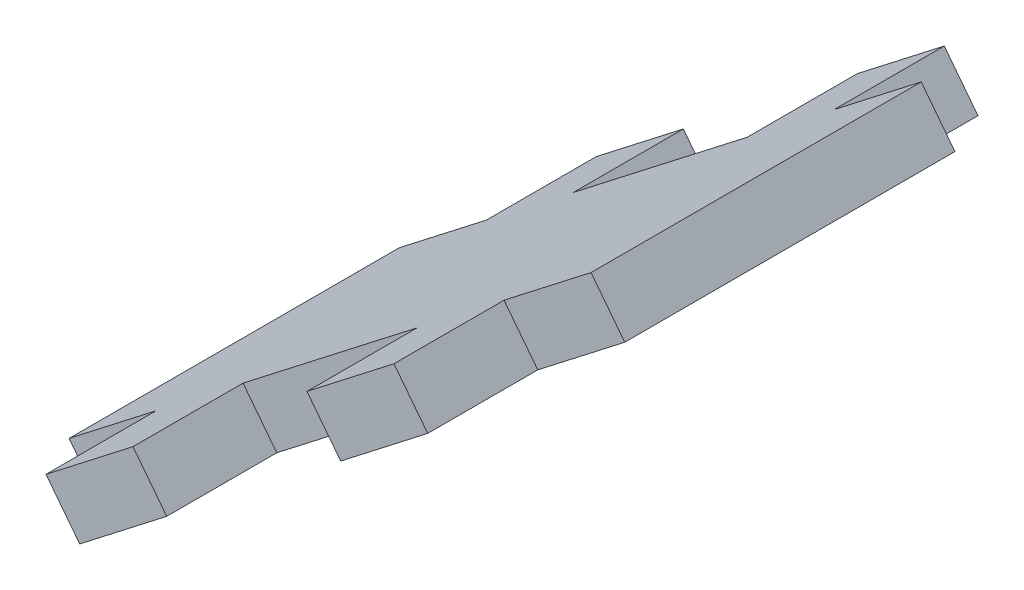
ISO-10303-21;
HEADER;
FILE_DESCRIPTION(('STEP AP214'),'2;1');
FILE_NAME('part.step','',(''),(''),'','','');
FILE_SCHEMA(('AUTOMOTIVE_DESIGN { 1 0 10303 214 1 1 1 1 }'));
ENDSEC;
DATA;
#1=APPLICATION_CONTEXT('core data for automotive mechanical design processes');
#2=APPLICATION_PROTOCOL_DEFINITION('international standard','automotive_design',2000,#1);
#3=PRODUCT_CONTEXT('',#1,'mechanical');
#4=PRODUCT('Part','Part','',(#3));
#5=PRODUCT_RELATED_PRODUCT_CATEGORY('part','',(#4));
#6=PRODUCT_DEFINITION_FORMATION('','',#4);
#7=PRODUCT_DEFINITION_CONTEXT('part definition',#1,'design');
#8=PRODUCT_DEFINITION('design','',#6,#7);
#9=PRODUCT_DEFINITION_SHAPE('','',#8);
#10=(LENGTH_UNIT() NAMED_UNIT(*) SI_UNIT(.MILLI.,.METRE.));
#11=(NAMED_UNIT(*) PLANE_ANGLE_UNIT() SI_UNIT($,.RADIAN.));
#12=(NAMED_UNIT(*) SI_UNIT($,.STERADIAN.) SOLID_ANGLE_UNIT());
#13=UNCERTAINTY_MEASURE_WITH_UNIT(LENGTH_MEASURE(1.E-05),#10,'distance_accuracy_value','');
#14=(GEOMETRIC_REPRESENTATION_CONTEXT(3) GLOBAL_UNCERTAINTY_ASSIGNED_CONTEXT((#13)) GLOBAL_UNIT_ASSIGNED_CONTEXT((#10,
#11,#12)) REPRESENTATION_CONTEXT('',''));
#15=CARTESIAN_POINT('',(0.,0.,0.));
#16=DIRECTION('',(0.,0.,1.));
#17=DIRECTION('',(1.,0.,0.));
#18=AXIS2_PLACEMENT_3D('',#15,#16,#17);
#19=CARTESIAN_POINT('',(0.,0.,0.));
#20=DIRECTION('',(0.,0.,-1.));
#21=DIRECTION('',(-1.,0.,0.));
#22=AXIS2_PLACEMENT_3D('',#19,#20,#21);
#23=PLANE('',#22);
#24=DIRECTION('',(-0.790358439275779,-0.612644707367618,0.));
#25=VECTOR('',#24,1.);
#26=CARTESIAN_POINT('',(-104.229947398695,305.349449517999,0.));
#27=LINE('',#26,#25);
#28=CARTESIAN_POINT('',(-124.305051756299,289.788273950861,0.));
#29=VERTEX_POINT('',#28);
#30=CARTESIAN_POINT('',(-129.323827845701,285.897980059077,0.));
#31=VERTEX_POINT('',#30);
#32=EDGE_CURVE('E247',#29,#31,#27,.T.);
#33=ORIENTED_EDGE('',*,*,#32,.F.);
#34=DIRECTION('',(-0.612644707367617,0.79035843927578,0.));
#35=VECTOR('',#34,1.);
#36=CARTESIAN_POINT('',(62.668868679989,48.5776437696957,0.));
#37=LINE('',#36,#35);
#38=CARTESIAN_POINT('',(-126.250198702192,292.297661995562,0.));
#39=VERTEX_POINT('',#38);
#40=EDGE_CURVE('E230',#29,#39,#37,.T.);
#41=ORIENTED_EDGE('',*,*,#40,.T.);
#42=DIRECTION('',(0.79035843927578,0.612644707367617,0.));
#43=VECTOR('',#42,1.);
#44=CARTESIAN_POINT('',(-136.287750880994,284.517074211993,0.));
#45=LINE('',#44,#43);
#46=CARTESIAN_POINT('',(-131.268974791593,288.407368103778,0.));
#47=VERTEX_POINT('',#46);
#48=EDGE_CURVE('E243',#47,#39,#45,.T.);
#49=ORIENTED_EDGE('',*,*,#48,.F.);
#50=DIRECTION('',(0.612644707367617,-0.79035843927578,0.));
#51=VECTOR('',#50,1.);
#52=CARTESIAN_POINT('',(57.6500925905878,44.6873498779113,0.));
#53=LINE('',#52,#51);
#54=EDGE_CURVE('E221',#47,#31,#53,.T.);
#55=ORIENTED_EDGE('',*,*,#54,.T.);
#56=EDGE_LOOP('',(#33,#41,#49,#55));
#57=FACE_BOUND('',#56,.T.);
#58=ADVANCED_FACE('F33',(#57),#23,.F.);
#59=CARTESIAN_POINT('',(0.,0.,-31.75));
#60=DIRECTION('',(0.,0.,-1.));
#61=DIRECTION('',(-1.,0.,0.));
#62=AXIS2_PLACEMENT_3D('',#59,#60,#61);
#63=PLANE('',#62);
#64=DIRECTION('',(-0.612644707367617,0.79035843927578,0.));
#65=VECTOR('',#64,1.);
#66=CARTESIAN_POINT('',(62.668868679989,48.5776437696957,-31.75));
#67=LINE('',#66,#65);
#68=CARTESIAN_POINT('',(-124.305051756299,289.788273950861,-31.75));
#69=VERTEX_POINT('',#68);
#70=CARTESIAN_POINT('',(-126.250198702192,292.297661995562,-31.75));
#71=VERTEX_POINT('',#70);
#72=EDGE_CURVE('E216',#69,#71,#67,.T.);
#73=ORIENTED_EDGE('',*,*,#72,.F.);
#74=DIRECTION('',(-0.790358439275779,-0.612644707367618,0.));
#75=VECTOR('',#74,1.);
#76=CARTESIAN_POINT('',(-104.229947398695,305.349449517999,-31.75));
#77=LINE('',#76,#75);
#78=CARTESIAN_POINT('',(-129.323827845701,285.897980059077,-31.75));
#79=VERTEX_POINT('',#78);
#80=EDGE_CURVE('E262',#69,#79,#77,.T.);
#81=ORIENTED_EDGE('',*,*,#80,.T.);
#82=DIRECTION('',(0.612644707367617,-0.79035843927578,0.));
#83=VECTOR('',#82,1.);
#84=CARTESIAN_POINT('',(57.6500925905878,44.6873498779113,-31.75));
#85=LINE('',#84,#83);
#86=CARTESIAN_POINT('',(-131.268974791593,288.407368103778,-31.75));
#87=VERTEX_POINT('',#86);
#88=EDGE_CURVE('E197',#87,#79,#85,.T.);
#89=ORIENTED_EDGE('',*,*,#88,.F.);
#90=DIRECTION('',(0.79035843927578,0.612644707367617,0.));
#91=VECTOR('',#90,1.);
#92=CARTESIAN_POINT('',(-136.287750880994,284.517074211993,-31.75));
#93=LINE('',#92,#91);
#94=EDGE_CURVE('E267',#87,#71,#93,.T.);
#95=ORIENTED_EDGE('',*,*,#94,.T.);
#96=EDGE_LOOP('',(#73,#81,#89,#95));
#97=FACE_BOUND('',#96,.T.);
#98=ADVANCED_FACE('F369',(#97),#63,.T.);
#99=CARTESIAN_POINT('',(-134.342603935102,282.007686167293,-31.75));
#100=DIRECTION('',(0.79035843927578,0.612644707367617,0.));
#101=DIRECTION('',(-0.612644707367617,0.79035843927578,0.));
#102=AXIS2_PLACEMENT_3D('',#99,#100,#101);
#103=PLANE('',#102);
#104=DIRECTION('',(0.,0.,1.));
#105=VECTOR('',#104,1.);
#106=CARTESIAN_POINT('',(-134.342603935102,282.007686167293,-31.75));
#107=LINE('',#106,#105);
#108=CARTESIAN_POINT('',(-134.342603935102,282.007686167293,-25.3999999999999));
#109=VERTEX_POINT('',#108);
#110=CARTESIAN_POINT('',(-134.342603935102,282.007686167293,-6.35000000000001));
#111=VERTEX_POINT('',#110);
#112=EDGE_CURVE('E199',#109,#111,#107,.T.);
#113=ORIENTED_EDGE('',*,*,#112,.T.);
#114=DIRECTION('',(-0.612644707367617,0.79035843927578,0.));
#115=VECTOR('',#114,1.);
#116=CARTESIAN_POINT('',(-123.040314034807,267.426869425691,-6.35000000000001));
#117=LINE('',#116,#115);
#118=CARTESIAN_POINT('',(-136.287750880994,284.517074211993,-6.35000000000001));
#119=VERTEX_POINT('',#118);
#120=EDGE_CURVE('E315',#111,#119,#117,.T.);
#121=ORIENTED_EDGE('',*,*,#120,.T.);
#122=DIRECTION('',(0.,0.,1.));
#123=VECTOR('',#122,1.);
#124=CARTESIAN_POINT('',(-136.287750880994,284.517074211993,-31.75));
#125=LINE('',#124,#123);
#126=CARTESIAN_POINT('',(-136.287750880994,284.517074211993,-25.3999999999999));
#127=VERTEX_POINT('',#126);
#128=EDGE_CURVE('E193',#127,#119,#125,.T.);
#129=ORIENTED_EDGE('',*,*,#128,.F.);
#130=DIRECTION('',(-0.612644707367617,0.79035843927578,0.));
#131=VECTOR('',#130,1.);
#132=CARTESIAN_POINT('',(-123.040314034807,267.426869425691,-25.3999999999999));
#133=LINE('',#132,#131);
#134=EDGE_CURVE('E275',#109,#127,#133,.T.);
#135=ORIENTED_EDGE('',*,*,#134,.F.);
#136=EDGE_LOOP('',(#113,#121,#129,#135));
#137=FACE_BOUND('',#136,.T.);
#138=ADVANCED_FACE('F35',(#137),#103,.F.);
#139=CARTESIAN_POINT('',(-136.287750880994,284.517074211993,-31.75));
#140=DIRECTION('',(0.612644707367617,-0.79035843927578,0.));
#141=DIRECTION('',(0.79035843927578,0.612644707367617,0.));
#142=AXIS2_PLACEMENT_3D('',#139,#140,#141);
#143=PLANE('',#142);
#144=CARTESIAN_POINT('',(-116.212646523389,300.078249779131,0.));
#145=VERTEX_POINT('',#144);
#146=CARTESIAN_POINT('',(-111.193870433988,303.968543670915,0.));
#147=VERTEX_POINT('',#146);
#148=EDGE_CURVE('E238',#145,#147,#45,.T.);
#149=ORIENTED_EDGE('',*,*,#148,.T.);
#150=DIRECTION('',(0.,0.,1.));
#151=VECTOR('',#150,1.);
#152=CARTESIAN_POINT('',(-111.193870433988,303.968543670915,0.));
#153=LINE('',#152,#151);
#154=CARTESIAN_POINT('',(-111.193870433988,303.968543670915,-6.35));
#155=VERTEX_POINT('',#154);
#156=EDGE_CURVE('E48',#155,#147,#153,.T.);
#157=ORIENTED_EDGE('',*,*,#156,.F.);
#158=DIRECTION('',(-0.790358439275781,-0.612644707367617,0.));
#159=VECTOR('',#158,1.);
#160=CARTESIAN_POINT('',(-106.175094344587,307.858837562699,-6.35000000000001));
#161=LINE('',#160,#159);
#162=CARTESIAN_POINT('',(-106.175094344587,307.858837562699,-6.35000000000001));
#163=VERTEX_POINT('',#162);
#164=EDGE_CURVE('E176',#163,#155,#161,.T.);
#165=ORIENTED_EDGE('',*,*,#164,.F.);
#166=DIRECTION('',(0.,0.,1.));
#167=VECTOR('',#166,1.);
#168=CARTESIAN_POINT('',(-106.175094344587,307.858837562699,-31.75));
#169=LINE('',#168,#167);
#170=CARTESIAN_POINT('',(-106.175094344587,307.858837562699,-25.3999999999999));
#171=VERTEX_POINT('',#170);
#172=EDGE_CURVE('E188',#171,#163,#169,.T.);
#173=ORIENTED_EDGE('',*,*,#172,.F.);
#174=DIRECTION('',(0.790358439275781,0.612644707367617,0.));
#175=VECTOR('',#174,1.);
#176=CARTESIAN_POINT('',(-106.175094344587,307.858837562699,-25.3999999999999));
#177=LINE('',#176,#175);
#178=CARTESIAN_POINT('',(-111.193870433988,303.968543670915,-25.3999999999999));
#179=VERTEX_POINT('',#178);
#180=EDGE_CURVE('E288',#179,#171,#177,.T.);
#181=ORIENTED_EDGE('',*,*,#180,.F.);
#182=DIRECTION('',(0.,0.,1.));
#183=VECTOR('',#182,1.);
#184=CARTESIAN_POINT('',(-111.193870433988,303.968543670915,-31.75));
#185=LINE('',#184,#183);
#186=CARTESIAN_POINT('',(-111.193870433988,303.968543670915,-31.75));
#187=VERTEX_POINT('',#186);
#188=EDGE_CURVE('E291',#187,#179,#185,.T.);
#189=ORIENTED_EDGE('',*,*,#188,.F.);
#190=CARTESIAN_POINT('',(-116.212646523389,300.078249779131,-31.75));
#191=VERTEX_POINT('',#190);
#192=EDGE_CURVE('E255',#191,#187,#93,.T.);
#193=ORIENTED_EDGE('',*,*,#192,.F.);
#194=DIRECTION('',(0.,0.,-1.));
#195=VECTOR('',#194,1.);
#196=CARTESIAN_POINT('',(-116.212646523389,300.078249779131,-31.75));
#197=LINE('',#196,#195);
#198=CARTESIAN_POINT('',(-116.212646523389,300.078249779131,-25.3999999999999));
#199=VERTEX_POINT('',#198);
#200=EDGE_CURVE('E303',#199,#191,#197,.T.);
#201=ORIENTED_EDGE('',*,*,#200,.F.);
#202=DIRECTION('',(0.79035843927578,0.612644707367618,0.));
#203=VECTOR('',#202,1.);
#204=CARTESIAN_POINT('',(-126.250198702192,292.297661995562,-25.3999999999999));
#205=LINE('',#204,#203);
#206=CARTESIAN_POINT('',(-126.250198702192,292.297661995562,-25.3999999999999));
#207=VERTEX_POINT('',#206);
#208=EDGE_CURVE('E306',#207,#199,#205,.T.);
#209=ORIENTED_EDGE('',*,*,#208,.F.);
#210=DIRECTION('',(0.,0.,1.));
#211=VECTOR('',#210,1.);
#212=CARTESIAN_POINT('',(-126.250198702192,292.297661995562,-31.75));
#213=LINE('',#212,#211);
#214=EDGE_CURVE('E309',#71,#207,#213,.T.);
#215=ORIENTED_EDGE('',*,*,#214,.F.);
#216=ORIENTED_EDGE('',*,*,#94,.F.);
#217=DIRECTION('',(0.,0.,-1.));
#218=VECTOR('',#217,1.);
#219=CARTESIAN_POINT('',(-131.268974791593,288.407368103778,-31.75));
#220=LINE('',#219,#218);
#221=CARTESIAN_POINT('',(-131.268974791593,288.407368103778,-25.3999999999999));
#222=VERTEX_POINT('',#221);
#223=EDGE_CURVE('E277',#222,#87,#220,.T.);
#224=ORIENTED_EDGE('',*,*,#223,.F.);
#225=DIRECTION('',(0.79035843927578,0.612644707367618,0.));
#226=VECTOR('',#225,1.);
#227=CARTESIAN_POINT('',(-136.287750880994,284.517074211993,-25.3999999999999));
#228=LINE('',#227,#226);
#229=EDGE_CURVE('E280',#127,#222,#228,.T.);
#230=ORIENTED_EDGE('',*,*,#229,.F.);
#231=ORIENTED_EDGE('',*,*,#128,.T.);
#232=DIRECTION('',(-0.79035843927578,-0.612644707367618,0.));
#233=VECTOR('',#232,1.);
#234=CARTESIAN_POINT('',(-136.287750880994,284.517074211993,-6.35000000000001));
#235=LINE('',#234,#233);
#236=CARTESIAN_POINT('',(-131.268974791593,288.407368103778,-6.35));
#237=VERTEX_POINT('',#236);
#238=EDGE_CURVE('E318',#237,#119,#235,.T.);
#239=ORIENTED_EDGE('',*,*,#238,.F.);
#240=DIRECTION('',(0.,0.,-1.));
#241=VECTOR('',#240,1.);
#242=CARTESIAN_POINT('',(-131.268974791593,288.407368103778,0.));
#243=LINE('',#242,#241);
#244=EDGE_CURVE('E321',#47,#237,#243,.T.);
#245=ORIENTED_EDGE('',*,*,#244,.F.);
#246=ORIENTED_EDGE('',*,*,#48,.T.);
#247=DIRECTION('',(0.,0.,1.));
#248=VECTOR('',#247,1.);
#249=CARTESIAN_POINT('',(-126.250198702192,292.297661995562,0.));
#250=LINE('',#249,#248);
#251=CARTESIAN_POINT('',(-126.250198702192,292.297661995562,-6.35));
#252=VERTEX_POINT('',#251);
#253=EDGE_CURVE('E337',#252,#39,#250,.T.);
#254=ORIENTED_EDGE('',*,*,#253,.F.);
#255=DIRECTION('',(-0.79035843927578,-0.612644707367618,0.));
#256=VECTOR('',#255,1.);
#257=CARTESIAN_POINT('',(-126.250198702192,292.297661995562,-6.35));
#258=LINE('',#257,#256);
#259=CARTESIAN_POINT('',(-116.212646523389,300.078249779131,-6.35));
#260=VERTEX_POINT('',#259);
#261=EDGE_CURVE('E332',#260,#252,#258,.T.);
#262=ORIENTED_EDGE('',*,*,#261,.F.);
#263=DIRECTION('',(0.,0.,-1.));
#264=VECTOR('',#263,1.);
#265=CARTESIAN_POINT('',(-116.212646523389,300.078249779131,0.));
#266=LINE('',#265,#264);
#267=EDGE_CURVE('E242',#145,#260,#266,.T.);
#268=ORIENTED_EDGE('',*,*,#267,.F.);
#269=EDGE_LOOP('',(#149,#157,#165,#173,#181,#189,#193,#201,#209,#215,#216,#224,#230,#231,#239,
#245,#246,#254,#262,#268));
#270=FACE_BOUND('',#269,.T.);
#271=ADVANCED_FACE('F186',(#270),#143,.F.);
#272=CARTESIAN_POINT('',(-106.175094344587,307.858837562699,-31.75));
#273=DIRECTION('',(-0.79035843927578,-0.612644707367617,0.));
#274=DIRECTION('',(0.612644707367617,-0.79035843927578,0.));
#275=AXIS2_PLACEMENT_3D('',#272,#273,#274);
#276=PLANE('',#275);
#277=ORIENTED_EDGE('',*,*,#172,.T.);
#278=DIRECTION('',(-0.612644707367617,0.79035843927578,0.));
#279=VECTOR('',#278,1.);
#280=CARTESIAN_POINT('',(-92.9276574983996,290.768632776397,-6.35000000000001));
#281=LINE('',#280,#279);
#282=CARTESIAN_POINT('',(-104.229947398695,305.349449517999,-6.35));
#283=VERTEX_POINT('',#282);
#284=EDGE_CURVE('E172',#283,#163,#281,.T.);
#285=ORIENTED_EDGE('',*,*,#284,.F.);
#286=DIRECTION('',(0.,0.,1.));
#287=VECTOR('',#286,1.);
#288=CARTESIAN_POINT('',(-104.229947398695,305.349449517999,-31.75));
#289=LINE('',#288,#287);
#290=CARTESIAN_POINT('',(-104.229947398695,305.349449517999,-25.3999999999999));
#291=VERTEX_POINT('',#290);
#292=EDGE_CURVE('E194',#291,#283,#289,.T.);
#293=ORIENTED_EDGE('',*,*,#292,.F.);
#294=DIRECTION('',(-0.612644707367617,0.79035843927578,0.));
#295=VECTOR('',#294,1.);
#296=CARTESIAN_POINT('',(-92.9276574983996,290.768632776397,-25.3999999999999));
#297=LINE('',#296,#295);
#298=EDGE_CURVE('E192',#291,#171,#297,.T.);
#299=ORIENTED_EDGE('',*,*,#298,.T.);
#300=EDGE_LOOP('',(#277,#285,#293,#299));
#301=FACE_BOUND('',#300,.T.);
#302=ADVANCED_FACE('F191',(#301),#276,.F.);
#303=CARTESIAN_POINT('',(-104.229947398695,305.349449517999,-31.75));
#304=DIRECTION('',(-0.612644707367618,0.790358439275779,0.));
#305=DIRECTION('',(-0.790358439275779,-0.612644707367618,0.));
#306=AXIS2_PLACEMENT_3D('',#303,#304,#305);
#307=PLANE('',#306);
#308=DIRECTION('',(-0.790358439275779,-0.612644707367618,0.));
#309=VECTOR('',#308,1.);
#310=CARTESIAN_POINT('',(-104.229947398695,305.349449517999,-6.35));
#311=LINE('',#310,#309);
#312=CARTESIAN_POINT('',(-109.248723488096,301.459155626214,-6.35));
#313=VERTEX_POINT('',#312);
#314=EDGE_CURVE('E11',#283,#313,#311,.T.);
#315=ORIENTED_EDGE('',*,*,#314,.T.);
#316=DIRECTION('',(0.,0.,1.));
#317=VECTOR('',#316,1.);
#318=CARTESIAN_POINT('',(-109.248723488096,301.459155626214,-31.75));
#319=LINE('',#318,#317);
#320=CARTESIAN_POINT('',(-109.248723488096,301.459155626214,0.));
#321=VERTEX_POINT('',#320);
#322=EDGE_CURVE('E339',#313,#321,#319,.T.);
#323=ORIENTED_EDGE('',*,*,#322,.T.);
#324=CARTESIAN_POINT('',(-114.267499577497,297.56886173443,0.));
#325=VERTEX_POINT('',#324);
#326=EDGE_CURVE('E56',#321,#325,#27,.T.);
#327=ORIENTED_EDGE('',*,*,#326,.T.);
#328=DIRECTION('',(0.,0.,-1.));
#329=VECTOR('',#328,1.);
#330=CARTESIAN_POINT('',(-114.267499577497,297.56886173443,-31.75));
#331=LINE('',#330,#329);
#332=CARTESIAN_POINT('',(-114.267499577497,297.56886173443,-6.35));
#333=VERTEX_POINT('',#332);
#334=EDGE_CURVE('E327',#325,#333,#331,.T.);
#335=ORIENTED_EDGE('',*,*,#334,.T.);
#336=DIRECTION('',(-0.790358439275779,-0.612644707367618,0.));
#337=VECTOR('',#336,1.);
#338=CARTESIAN_POINT('',(-104.229947398695,305.349449517999,-6.35));
#339=LINE('',#338,#337);
#340=CARTESIAN_POINT('',(-124.305051756299,289.788273950861,-6.35));
#341=VERTEX_POINT('',#340);
#342=EDGE_CURVE('E233',#333,#341,#339,.T.);
#343=ORIENTED_EDGE('',*,*,#342,.T.);
#344=DIRECTION('',(0.,0.,1.));
#345=VECTOR('',#344,1.);
#346=CARTESIAN_POINT('',(-124.305051756299,289.788273950861,-31.75));
#347=LINE('',#346,#345);
#348=EDGE_CURVE('E324',#341,#29,#347,.T.);
#349=ORIENTED_EDGE('',*,*,#348,.T.);
#350=ORIENTED_EDGE('',*,*,#32,.T.);
#351=DIRECTION('',(0.,0.,-1.));
#352=VECTOR('',#351,1.);
#353=CARTESIAN_POINT('',(-129.323827845701,285.897980059077,-31.75));
#354=LINE('',#353,#352);
#355=CARTESIAN_POINT('',(-129.323827845701,285.897980059077,-6.35));
#356=VERTEX_POINT('',#355);
#357=EDGE_CURVE('E312',#31,#356,#354,.T.);
#358=ORIENTED_EDGE('',*,*,#357,.T.);
#359=DIRECTION('',(-0.790358439275779,-0.612644707367618,0.));
#360=VECTOR('',#359,1.);
#361=CARTESIAN_POINT('',(-104.229947398695,305.349449517999,-6.34999999999998));
#362=LINE('',#361,#360);
#363=EDGE_CURVE('E224',#356,#111,#362,.T.);
#364=ORIENTED_EDGE('',*,*,#363,.T.);
#365=ORIENTED_EDGE('',*,*,#112,.F.);
#366=DIRECTION('',(0.790358439275779,0.612644707367618,0.));
#367=VECTOR('',#366,1.);
#368=CARTESIAN_POINT('',(-104.229947398695,305.349449517999,-25.3999999999999));
#369=LINE('',#368,#367);
#370=CARTESIAN_POINT('',(-129.323827845701,285.897980059077,-25.3999999999999));
#371=VERTEX_POINT('',#370);
#372=EDGE_CURVE('E205',#109,#371,#369,.T.);
#373=ORIENTED_EDGE('',*,*,#372,.T.);
#374=DIRECTION('',(0.,0.,-1.));
#375=VECTOR('',#374,1.);
#376=CARTESIAN_POINT('',(-129.323827845701,285.897980059077,-31.75));
#377=LINE('',#376,#375);
#378=EDGE_CURVE('E244',#371,#79,#377,.T.);
#379=ORIENTED_EDGE('',*,*,#378,.T.);
#380=ORIENTED_EDGE('',*,*,#80,.F.);
#381=DIRECTION('',(0.,0.,1.));
#382=VECTOR('',#381,1.);
#383=CARTESIAN_POINT('',(-124.305051756299,289.788273950861,-31.75));
#384=LINE('',#383,#382);
#385=CARTESIAN_POINT('',(-124.305051756299,289.788273950861,-25.3999999999999));
#386=VERTEX_POINT('',#385);
#387=EDGE_CURVE('E294',#69,#386,#384,.T.);
#388=ORIENTED_EDGE('',*,*,#387,.T.);
#389=DIRECTION('',(0.790358439275779,0.612644707367618,0.));
#390=VECTOR('',#389,1.);
#391=CARTESIAN_POINT('',(-104.229947398695,305.349449517999,-25.3999999999999));
#392=LINE('',#391,#390);
#393=CARTESIAN_POINT('',(-114.267499577497,297.56886173443,-25.3999999999999));
#394=VERTEX_POINT('',#393);
#395=EDGE_CURVE('E218',#386,#394,#392,.T.);
#396=ORIENTED_EDGE('',*,*,#395,.T.);
#397=DIRECTION('',(0.,0.,-1.));
#398=VECTOR('',#397,1.);
#399=CARTESIAN_POINT('',(-114.267499577497,297.56886173443,-31.75));
#400=LINE('',#399,#398);
#401=CARTESIAN_POINT('',(-114.267499577497,297.56886173443,-31.75));
#402=VERTEX_POINT('',#401);
#403=EDGE_CURVE('E297',#394,#402,#400,.T.);
#404=ORIENTED_EDGE('',*,*,#403,.T.);
#405=CARTESIAN_POINT('',(-109.248723488096,301.459155626214,-31.75));
#406=VERTEX_POINT('',#405);
#407=EDGE_CURVE('E253',#406,#402,#77,.T.);
#408=ORIENTED_EDGE('',*,*,#407,.F.);
#409=DIRECTION('',(0.,0.,1.));
#410=VECTOR('',#409,1.);
#411=CARTESIAN_POINT('',(-109.248723488096,301.459155626214,-31.75));
#412=LINE('',#411,#410);
#413=CARTESIAN_POINT('',(-109.248723488096,301.459155626214,-25.3999999999999));
#414=VERTEX_POINT('',#413);
#415=EDGE_CURVE('E283',#406,#414,#412,.T.);
#416=ORIENTED_EDGE('',*,*,#415,.T.);
#417=DIRECTION('',(0.790358439275779,0.612644707367618,0.));
#418=VECTOR('',#417,1.);
#419=CARTESIAN_POINT('',(-104.229947398695,305.349449517999,-25.3999999999999));
#420=LINE('',#419,#418);
#421=EDGE_CURVE('E211',#414,#291,#420,.T.);
#422=ORIENTED_EDGE('',*,*,#421,.T.);
#423=ORIENTED_EDGE('',*,*,#292,.T.);
#424=EDGE_LOOP('',(#315,#323,#327,#335,#343,#349,#350,#358,#364,#365,#373,#379,#380,#388,#396,
#404,#408,#416,#422,#423));
#425=FACE_BOUND('',#424,.T.);
#426=ADVANCED_FACE('F343',(#425),#307,.F.);
#427=DIRECTION('',(0.612644707367617,-0.79035843927578,0.));
#428=VECTOR('',#427,1.);
#429=CARTESIAN_POINT('',(72.7064208587915,56.3582315532645,-31.75));
#430=LINE('',#429,#428);
#431=EDGE_CURVE('E214',#191,#402,#430,.T.);
#432=ORIENTED_EDGE('',*,*,#431,.F.);
#433=ORIENTED_EDGE('',*,*,#192,.T.);
#434=DIRECTION('',(-0.612644707367617,0.79035843927578,0.));
#435=VECTOR('',#434,1.);
#436=CARTESIAN_POINT('',(77.7251969481926,60.2485254450488,-31.75));
#437=LINE('',#436,#435);
#438=EDGE_CURVE('E208',#406,#187,#437,.T.);
#439=ORIENTED_EDGE('',*,*,#438,.F.);
#440=ORIENTED_EDGE('',*,*,#407,.T.);
#441=EDGE_LOOP('',(#432,#433,#439,#440));
#442=FACE_BOUND('',#441,.T.);
#443=ADVANCED_FACE('F353',(#442),#63,.T.);
#444=ORIENTED_EDGE('',*,*,#326,.F.);
#445=DIRECTION('',(-0.612644707367617,0.79035843927578,0.));
#446=VECTOR('',#445,1.);
#447=CARTESIAN_POINT('',(77.7251969481926,60.2485254450488,0.));
#448=LINE('',#447,#446);
#449=EDGE_CURVE('E41',#321,#147,#448,.T.);
#450=ORIENTED_EDGE('',*,*,#449,.T.);
#451=ORIENTED_EDGE('',*,*,#148,.F.);
#452=DIRECTION('',(0.612644707367617,-0.79035843927578,0.));
#453=VECTOR('',#452,1.);
#454=CARTESIAN_POINT('',(72.7064208587915,56.3582315532645,0.));
#455=LINE('',#454,#453);
#456=EDGE_CURVE('E227',#145,#325,#455,.T.);
#457=ORIENTED_EDGE('',*,*,#456,.T.);
#458=EDGE_LOOP('',(#444,#450,#451,#457));
#459=FACE_BOUND('',#458,.T.);
#460=ADVANCED_FACE('F237',(#459),#23,.F.);
#461=CARTESIAN_POINT('',(-123.040314034807,267.426869425691,-25.3999999999999));
#462=DIRECTION('',(0.,0.,1.));
#463=DIRECTION('',(1.,0.,0.));
#464=AXIS2_PLACEMENT_3D('',#461,#462,#463);
#465=PLANE('',#464);
#466=ORIENTED_EDGE('',*,*,#134,.T.);
#467=ORIENTED_EDGE('',*,*,#229,.T.);
#468=DIRECTION('',(-0.612644707367617,0.79035843927578,0.));
#469=VECTOR('',#468,1.);
#470=CARTESIAN_POINT('',(-118.021537945406,271.317163317475,-25.3999999999999));
#471=LINE('',#470,#469);
#472=EDGE_CURVE('E249',#371,#222,#471,.T.);
#473=ORIENTED_EDGE('',*,*,#472,.F.);
#474=ORIENTED_EDGE('',*,*,#372,.F.);
#475=EDGE_LOOP('',(#466,#467,#473,#474));
#476=FACE_BOUND('',#475,.T.);
#477=ADVANCED_FACE('F384',(#476),#465,.F.);
#478=CARTESIAN_POINT('',(-118.021537945406,271.317163317475,-31.75));
#479=DIRECTION('',(0.79035843927578,0.612644707367617,0.));
#480=DIRECTION('',(-0.612644707367617,0.79035843927578,0.));
#481=AXIS2_PLACEMENT_3D('',#478,#479,#480);
#482=PLANE('',#481);
#483=ORIENTED_EDGE('',*,*,#472,.T.);
#484=ORIENTED_EDGE('',*,*,#223,.T.);
#485=ORIENTED_EDGE('',*,*,#88,.T.);
#486=ORIENTED_EDGE('',*,*,#378,.F.);
#487=EDGE_LOOP('',(#483,#484,#485,#486));
#488=FACE_BOUND('',#487,.T.);
#489=ADVANCED_FACE('F367',(#488),#482,.F.);
#490=CARTESIAN_POINT('',(-92.9276574983996,290.768632776397,-25.3999999999999));
#491=DIRECTION('',(0.,0.,1.));
#492=DIRECTION('',(1.,0.,0.));
#493=AXIS2_PLACEMENT_3D('',#490,#491,#492);
#494=PLANE('',#493);
#495=DIRECTION('',(-0.612644707367617,0.79035843927578,0.));
#496=VECTOR('',#495,1.);
#497=CARTESIAN_POINT('',(-97.9464335878008,286.878338884613,-25.3999999999999));
#498=LINE('',#497,#496);
#499=EDGE_CURVE('E286',#414,#179,#498,.T.);
#500=ORIENTED_EDGE('',*,*,#499,.T.);
#501=ORIENTED_EDGE('',*,*,#180,.T.);
#502=ORIENTED_EDGE('',*,*,#298,.F.);
#503=ORIENTED_EDGE('',*,*,#421,.F.);
#504=EDGE_LOOP('',(#500,#501,#502,#503));
#505=FACE_BOUND('',#504,.T.);
#506=ADVANCED_FACE('F346',(#505),#494,.F.);
#507=CARTESIAN_POINT('',(-97.9464335878008,286.878338884613,-31.75));
#508=DIRECTION('',(-0.79035843927578,-0.612644707367617,0.));
#509=DIRECTION('',(0.612644707367617,-0.79035843927578,0.));
#510=AXIS2_PLACEMENT_3D('',#507,#508,#509);
#511=PLANE('',#510);
#512=ORIENTED_EDGE('',*,*,#438,.T.);
#513=ORIENTED_EDGE('',*,*,#188,.T.);
#514=ORIENTED_EDGE('',*,*,#499,.F.);
#515=ORIENTED_EDGE('',*,*,#415,.F.);
#516=EDGE_LOOP('',(#512,#513,#514,#515));
#517=FACE_BOUND('',#516,.T.);
#518=ADVANCED_FACE('F348',(#517),#511,.F.);
#519=CARTESIAN_POINT('',(-113.002761856004,275.207457209259,-25.3999999999999));
#520=DIRECTION('',(0.,0.,1.));
#521=DIRECTION('',(1.,0.,0.));
#522=AXIS2_PLACEMENT_3D('',#519,#520,#521);
#523=PLANE('',#522);
#524=DIRECTION('',(-0.612644707367617,0.79035843927578,0.));
#525=VECTOR('',#524,1.);
#526=CARTESIAN_POINT('',(-113.002761856004,275.207457209259,-25.3999999999999));
#527=LINE('',#526,#525);
#528=EDGE_CURVE('E301',#386,#207,#527,.T.);
#529=ORIENTED_EDGE('',*,*,#528,.T.);
#530=ORIENTED_EDGE('',*,*,#208,.T.);
#531=DIRECTION('',(-0.612644707367617,0.79035843927578,0.));
#532=VECTOR('',#531,1.);
#533=CARTESIAN_POINT('',(-102.965209677202,282.988044992828,-25.3999999999999));
#534=LINE('',#533,#532);
#535=EDGE_CURVE('E300',#394,#199,#534,.T.);
#536=ORIENTED_EDGE('',*,*,#535,.F.);
#537=ORIENTED_EDGE('',*,*,#395,.F.);
#538=EDGE_LOOP('',(#529,#530,#536,#537));
#539=FACE_BOUND('',#538,.T.);
#540=ADVANCED_FACE('F359',(#539),#523,.F.);
#541=CARTESIAN_POINT('',(-113.002761856004,275.207457209259,-31.75));
#542=DIRECTION('',(-0.79035843927578,-0.612644707367617,0.));
#543=DIRECTION('',(0.612644707367617,-0.79035843927578,0.));
#544=AXIS2_PLACEMENT_3D('',#541,#542,#543);
#545=PLANE('',#544);
#546=ORIENTED_EDGE('',*,*,#72,.T.);
#547=ORIENTED_EDGE('',*,*,#214,.T.);
#548=ORIENTED_EDGE('',*,*,#528,.F.);
#549=ORIENTED_EDGE('',*,*,#387,.F.);
#550=EDGE_LOOP('',(#546,#547,#548,#549));
#551=FACE_BOUND('',#550,.T.);
#552=ADVANCED_FACE('F361',(#551),#545,.F.);
#553=CARTESIAN_POINT('',(-102.965209677202,282.988044992828,-31.75));
#554=DIRECTION('',(0.79035843927578,0.612644707367617,0.));
#555=DIRECTION('',(-0.612644707367617,0.79035843927578,0.));
#556=AXIS2_PLACEMENT_3D('',#553,#554,#555);
#557=PLANE('',#556);
#558=ORIENTED_EDGE('',*,*,#535,.T.);
#559=ORIENTED_EDGE('',*,*,#200,.T.);
#560=ORIENTED_EDGE('',*,*,#431,.T.);
#561=ORIENTED_EDGE('',*,*,#403,.F.);
#562=EDGE_LOOP('',(#558,#559,#560,#561));
#563=FACE_BOUND('',#562,.T.);
#564=ADVANCED_FACE('F355',(#563),#557,.F.);
#565=CARTESIAN_POINT('',(-123.040314034807,267.426869425691,-6.35000000000001));
#566=DIRECTION('',(0.,0.,-1.));
#567=DIRECTION('',(-1.,0.,0.));
#568=AXIS2_PLACEMENT_3D('',#565,#566,#567);
#569=PLANE('',#568);
#570=DIRECTION('',(-0.612644707367617,0.79035843927578,0.));
#571=VECTOR('',#570,1.);
#572=CARTESIAN_POINT('',(-118.021537945406,271.317163317475,-6.35));
#573=LINE('',#572,#571);
#574=EDGE_CURVE('E316',#356,#237,#573,.T.);
#575=ORIENTED_EDGE('',*,*,#574,.T.);
#576=ORIENTED_EDGE('',*,*,#238,.T.);
#577=ORIENTED_EDGE('',*,*,#120,.F.);
#578=ORIENTED_EDGE('',*,*,#363,.F.);
#579=EDGE_LOOP('',(#575,#576,#577,#578));
#580=FACE_BOUND('',#579,.T.);
#581=ADVANCED_FACE('F472',(#580),#569,.F.);
#582=CARTESIAN_POINT('',(-118.021537945406,271.317163317475,0.));
#583=DIRECTION('',(0.79035843927578,0.612644707367617,0.));
#584=DIRECTION('',(-0.612644707367617,0.79035843927578,0.));
#585=AXIS2_PLACEMENT_3D('',#582,#583,#584);
#586=PLANE('',#585);
#587=ORIENTED_EDGE('',*,*,#54,.F.);
#588=ORIENTED_EDGE('',*,*,#244,.T.);
#589=ORIENTED_EDGE('',*,*,#574,.F.);
#590=ORIENTED_EDGE('',*,*,#357,.F.);
#591=EDGE_LOOP('',(#587,#588,#589,#590));
#592=FACE_BOUND('',#591,.T.);
#593=ADVANCED_FACE('F481',(#592),#586,.F.);
#594=CARTESIAN_POINT('',(-113.002761856004,275.207457209259,-6.35));
#595=DIRECTION('',(0.,0.,-1.));
#596=DIRECTION('',(-1.,0.,0.));
#597=AXIS2_PLACEMENT_3D('',#594,#595,#596);
#598=PLANE('',#597);
#599=DIRECTION('',(-0.612644707367617,0.79035843927578,0.));
#600=VECTOR('',#599,1.);
#601=CARTESIAN_POINT('',(-102.965209677202,282.988044992828,-6.35));
#602=LINE('',#601,#600);
#603=EDGE_CURVE('E330',#333,#260,#602,.T.);
#604=ORIENTED_EDGE('',*,*,#603,.T.);
#605=ORIENTED_EDGE('',*,*,#261,.T.);
#606=DIRECTION('',(-0.612644707367617,0.79035843927578,0.));
#607=VECTOR('',#606,1.);
#608=CARTESIAN_POINT('',(-113.002761856004,275.207457209259,-6.35));
#609=LINE('',#608,#607);
#610=EDGE_CURVE('E329',#341,#252,#609,.T.);
#611=ORIENTED_EDGE('',*,*,#610,.F.);
#612=ORIENTED_EDGE('',*,*,#342,.F.);
#613=EDGE_LOOP('',(#604,#605,#611,#612));
#614=FACE_BOUND('',#613,.T.);
#615=ADVANCED_FACE('F491',(#614),#598,.F.);
#616=CARTESIAN_POINT('',(-113.002761856004,275.207457209259,0.));
#617=DIRECTION('',(-0.79035843927578,-0.612644707367617,0.));
#618=DIRECTION('',(0.612644707367617,-0.79035843927578,0.));
#619=AXIS2_PLACEMENT_3D('',#616,#617,#618);
#620=PLANE('',#619);
#621=ORIENTED_EDGE('',*,*,#610,.T.);
#622=ORIENTED_EDGE('',*,*,#253,.T.);
#623=ORIENTED_EDGE('',*,*,#40,.F.);
#624=ORIENTED_EDGE('',*,*,#348,.F.);
#625=EDGE_LOOP('',(#621,#622,#623,#624));
#626=FACE_BOUND('',#625,.T.);
#627=ADVANCED_FACE('F501',(#626),#620,.F.);
#628=CARTESIAN_POINT('',(-102.965209677202,282.988044992828,0.));
#629=DIRECTION('',(0.79035843927578,0.612644707367617,0.));
#630=DIRECTION('',(-0.612644707367617,0.79035843927578,0.));
#631=AXIS2_PLACEMENT_3D('',#628,#629,#630);
#632=PLANE('',#631);
#633=ORIENTED_EDGE('',*,*,#456,.F.);
#634=ORIENTED_EDGE('',*,*,#267,.T.);
#635=ORIENTED_EDGE('',*,*,#603,.F.);
#636=ORIENTED_EDGE('',*,*,#334,.F.);
#637=EDGE_LOOP('',(#633,#634,#635,#636));
#638=FACE_BOUND('',#637,.T.);
#639=ADVANCED_FACE('F511',(#638),#632,.F.);
#640=CARTESIAN_POINT('',(-92.9276574983996,290.768632776397,-6.35000000000001));
#641=DIRECTION('',(0.,0.,-1.));
#642=DIRECTION('',(-1.,0.,0.));
#643=AXIS2_PLACEMENT_3D('',#640,#641,#642);
#644=PLANE('',#643);
#645=ORIENTED_EDGE('',*,*,#284,.T.);
#646=ORIENTED_EDGE('',*,*,#164,.T.);
#647=DIRECTION('',(-0.612644707367617,0.79035843927578,0.));
#648=VECTOR('',#647,1.);
#649=CARTESIAN_POINT('',(-97.9464335878008,286.878338884613,-6.35));
#650=LINE('',#649,#648);
#651=EDGE_CURVE('E181',#313,#155,#650,.T.);
#652=ORIENTED_EDGE('',*,*,#651,.F.);
#653=ORIENTED_EDGE('',*,*,#314,.F.);
#654=EDGE_LOOP('',(#645,#646,#652,#653));
#655=FACE_BOUND('',#654,.T.);
#656=ADVANCED_FACE('F174',(#655),#644,.F.);
#657=CARTESIAN_POINT('',(-97.9464335878008,286.878338884613,0.));
#658=DIRECTION('',(-0.79035843927578,-0.612644707367617,0.));
#659=DIRECTION('',(0.612644707367617,-0.79035843927578,0.));
#660=AXIS2_PLACEMENT_3D('',#657,#658,#659);
#661=PLANE('',#660);
#662=ORIENTED_EDGE('',*,*,#651,.T.);
#663=ORIENTED_EDGE('',*,*,#156,.T.);
#664=ORIENTED_EDGE('',*,*,#449,.F.);
#665=ORIENTED_EDGE('',*,*,#322,.F.);
#666=EDGE_LOOP('',(#662,#663,#664,#665));
#667=FACE_BOUND('',#666,.T.);
#668=ADVANCED_FACE('F342',(#667),#661,.F.);
#669=CLOSED_SHELL('',(#58,#98,#138,#271,#302,#426,#443,#460,#477,#489,#506,#518,#540,#552,#564,
#581,#593,#615,#627,#639,#656,#668));
#670=MANIFOLD_SOLID_BREP('B2',#669);
#671=ADVANCED_BREP_SHAPE_REPRESENTATION('',(#18,#670),#14);
#672=SHAPE_DEFINITION_REPRESENTATION(#9,#671);
ENDSEC;
END-ISO-10303-21;
